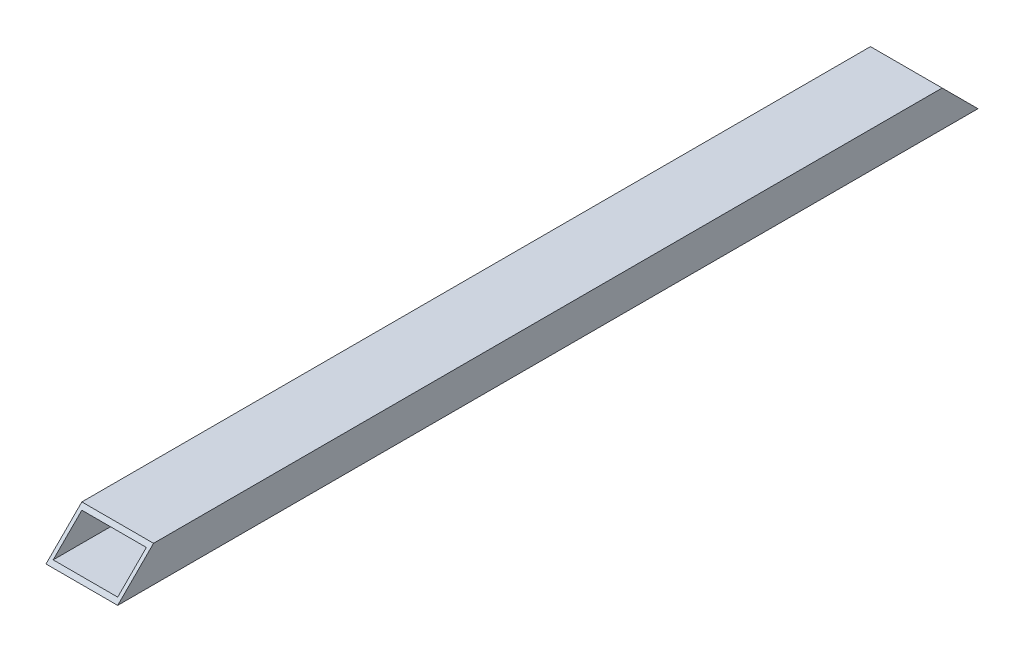
ISO-10303-21;
HEADER;
FILE_DESCRIPTION(('STEP AP214'),'2;1');
FILE_NAME('part.step','',(''),(''),'','','');
FILE_SCHEMA(('AUTOMOTIVE_DESIGN { 1 0 10303 214 1 1 1 1 }'));
ENDSEC;
DATA;
#1=APPLICATION_CONTEXT('core data for automotive mechanical design processes');
#2=APPLICATION_PROTOCOL_DEFINITION('international standard','automotive_design',2000,#1);
#3=PRODUCT_CONTEXT('',#1,'mechanical');
#4=PRODUCT('Part','Part','',(#3));
#5=PRODUCT_RELATED_PRODUCT_CATEGORY('part','',(#4));
#6=PRODUCT_DEFINITION_FORMATION('','',#4);
#7=PRODUCT_DEFINITION_CONTEXT('part definition',#1,'design');
#8=PRODUCT_DEFINITION('design','',#6,#7);
#9=PRODUCT_DEFINITION_SHAPE('','',#8);
#10=(LENGTH_UNIT() NAMED_UNIT(*) SI_UNIT(.MILLI.,.METRE.));
#11=(NAMED_UNIT(*) PLANE_ANGLE_UNIT() SI_UNIT($,.RADIAN.));
#12=(NAMED_UNIT(*) SI_UNIT($,.STERADIAN.) SOLID_ANGLE_UNIT());
#13=UNCERTAINTY_MEASURE_WITH_UNIT(LENGTH_MEASURE(1.E-05),#10,'distance_accuracy_value','');
#14=(GEOMETRIC_REPRESENTATION_CONTEXT(3) GLOBAL_UNCERTAINTY_ASSIGNED_CONTEXT((#13)) GLOBAL_UNIT_ASSIGNED_CONTEXT((#10,
#11,#12)) REPRESENTATION_CONTEXT('',''));
#15=CARTESIAN_POINT('',(0.,0.,0.));
#16=DIRECTION('',(0.,0.,1.));
#17=DIRECTION('',(1.,0.,0.));
#18=AXIS2_PLACEMENT_3D('',#15,#16,#17);
#19=CARTESIAN_POINT('',(2.,-2.,480.));
#20=DIRECTION('',(0.,-1.,0.));
#21=DIRECTION('',(0.,0.,-1.));
#22=AXIS2_PLACEMENT_3D('',#19,#20,#21);
#23=PLANE('',#22);
#24=DIRECTION('',(1.,0.,0.));
#25=VECTOR('',#24,1.);
#26=CARTESIAN_POINT('',(2.,-2.,462.));
#27=LINE('',#26,#25);
#28=CARTESIAN_POINT('',(2.,-2.,462.));
#29=VERTEX_POINT('',#28);
#30=CARTESIAN_POINT('',(38.,-2.,462.));
#31=VERTEX_POINT('',#30);
#32=EDGE_CURVE('E11',#29,#31,#27,.T.);
#33=ORIENTED_EDGE('',*,*,#32,.F.);
#34=DIRECTION('',(0.,0.,-1.));
#35=VECTOR('',#34,1.);
#36=CARTESIAN_POINT('',(2.,-2.,480.));
#37=LINE('',#36,#35);
#38=CARTESIAN_POINT('',(2.,-2.,17.9999999999999));
#39=VERTEX_POINT('',#38);
#40=EDGE_CURVE('E141',#29,#39,#37,.T.);
#41=ORIENTED_EDGE('',*,*,#40,.T.);
#42=DIRECTION('',(-1.,0.,0.));
#43=VECTOR('',#42,1.);
#44=CARTESIAN_POINT('',(1.99999999999989,-2.,17.9999999999999));
#45=LINE('',#44,#43);
#46=CARTESIAN_POINT('',(38.,-2.,17.9999999999999));
#47=VERTEX_POINT('',#46);
#48=EDGE_CURVE('E49',#47,#39,#45,.T.);
#49=ORIENTED_EDGE('',*,*,#48,.F.);
#50=DIRECTION('',(0.,0.,-1.));
#51=VECTOR('',#50,1.);
#52=CARTESIAN_POINT('',(38.,-2.,480.));
#53=LINE('',#52,#51);
#54=EDGE_CURVE('E138',#31,#47,#53,.T.);
#55=ORIENTED_EDGE('',*,*,#54,.F.);
#56=EDGE_LOOP('',(#33,#41,#49,#55));
#57=FACE_BOUND('',#56,.T.);
#58=ADVANCED_FACE('F41',(#57),#23,.T.);
#59=CARTESIAN_POINT('',(38.,-2.,480.));
#60=DIRECTION('',(-1.,0.,0.));
#61=DIRECTION('',(0.,0.,1.));
#62=AXIS2_PLACEMENT_3D('',#59,#60,#61);
#63=PLANE('',#62);
#64=DIRECTION('',(0.,-0.707106781186549,0.707106781186546));
#65=VECTOR('',#64,1.);
#66=CARTESIAN_POINT('',(38.,-11.,471.));
#67=LINE('',#66,#65);
#68=CARTESIAN_POINT('',(38.,-18.,478.));
#69=VERTEX_POINT('',#68);
#70=EDGE_CURVE('E148',#31,#69,#67,.T.);
#71=ORIENTED_EDGE('',*,*,#70,.F.);
#72=ORIENTED_EDGE('',*,*,#54,.T.);
#73=DIRECTION('',(0.,0.70710678118655,0.707106781186545));
#74=VECTOR('',#73,1.);
#75=CARTESIAN_POINT('',(38.,229.,248.999999999998));
#76=LINE('',#75,#74);
#77=CARTESIAN_POINT('',(38.,-18.,1.99999999999995));
#78=VERTEX_POINT('',#77);
#79=EDGE_CURVE('E154',#78,#47,#76,.T.);
#80=ORIENTED_EDGE('',*,*,#79,.F.);
#81=DIRECTION('',(0.,0.,-1.));
#82=VECTOR('',#81,1.);
#83=CARTESIAN_POINT('',(38.,-18.,480.));
#84=LINE('',#83,#82);
#85=EDGE_CURVE('E135',#69,#78,#84,.T.);
#86=ORIENTED_EDGE('',*,*,#85,.F.);
#87=EDGE_LOOP('',(#71,#72,#80,#86));
#88=FACE_BOUND('',#87,.T.);
#89=ADVANCED_FACE('F184',(#88),#63,.T.);
#90=CARTESIAN_POINT('',(2.,-18.,480.));
#91=DIRECTION('',(0.,1.,0.));
#92=DIRECTION('',(0.,0.,1.));
#93=AXIS2_PLACEMENT_3D('',#90,#91,#92);
#94=PLANE('',#93);
#95=DIRECTION('',(-1.,0.,0.));
#96=VECTOR('',#95,1.);
#97=CARTESIAN_POINT('',(2.,-18.,478.));
#98=LINE('',#97,#96);
#99=CARTESIAN_POINT('',(2.,-18.,478.));
#100=VERTEX_POINT('',#99);
#101=EDGE_CURVE('E146',#69,#100,#98,.T.);
#102=ORIENTED_EDGE('',*,*,#101,.F.);
#103=ORIENTED_EDGE('',*,*,#85,.T.);
#104=DIRECTION('',(1.,0.,0.));
#105=VECTOR('',#104,1.);
#106=CARTESIAN_POINT('',(1.99999999999989,-18.,2.));
#107=LINE('',#106,#105);
#108=CARTESIAN_POINT('',(2.,-18.,2.));
#109=VERTEX_POINT('',#108);
#110=EDGE_CURVE('E152',#109,#78,#107,.T.);
#111=ORIENTED_EDGE('',*,*,#110,.F.);
#112=DIRECTION('',(0.,0.,-1.));
#113=VECTOR('',#112,1.);
#114=CARTESIAN_POINT('',(2.,-18.,480.));
#115=LINE('',#114,#113);
#116=EDGE_CURVE('E131',#100,#109,#115,.T.);
#117=ORIENTED_EDGE('',*,*,#116,.F.);
#118=EDGE_LOOP('',(#102,#103,#111,#117));
#119=FACE_BOUND('',#118,.T.);
#120=ADVANCED_FACE('F179',(#119),#94,.T.);
#121=CARTESIAN_POINT('',(2.,-2.,480.));
#122=DIRECTION('',(1.,0.,0.));
#123=DIRECTION('',(0.,1.,0.));
#124=AXIS2_PLACEMENT_3D('',#121,#122,#123);
#125=PLANE('',#124);
#126=DIRECTION('',(0.,0.707106781186549,-0.707106781186546));
#127=VECTOR('',#126,1.);
#128=CARTESIAN_POINT('',(2.,-11.,471.));
#129=LINE('',#128,#127);
#130=EDGE_CURVE('E144',#100,#29,#129,.T.);
#131=ORIENTED_EDGE('',*,*,#130,.F.);
#132=ORIENTED_EDGE('',*,*,#116,.T.);
#133=DIRECTION('',(0.,-0.70710678118655,-0.707106781186545));
#134=VECTOR('',#133,1.);
#135=CARTESIAN_POINT('',(1.99999999999996,229.,248.999999999998));
#136=LINE('',#135,#134);
#137=EDGE_CURVE('E150',#39,#109,#136,.T.);
#138=ORIENTED_EDGE('',*,*,#137,.F.);
#139=ORIENTED_EDGE('',*,*,#40,.F.);
#140=EDGE_LOOP('',(#131,#132,#138,#139));
#141=FACE_BOUND('',#140,.T.);
#142=ADVANCED_FACE('F170',(#141),#125,.T.);
#143=CARTESIAN_POINT('',(0.,-20.,0.));
#144=DIRECTION('',(0.,-0.707106781186545,0.70710678118655));
#145=DIRECTION('',(0.,-0.70710678118655,-0.707106781186545));
#146=AXIS2_PLACEMENT_3D('',#143,#144,#145);
#147=PLANE('',#146);
#148=ORIENTED_EDGE('',*,*,#137,.T.);
#149=ORIENTED_EDGE('',*,*,#110,.T.);
#150=ORIENTED_EDGE('',*,*,#79,.T.);
#151=ORIENTED_EDGE('',*,*,#48,.T.);
#152=EDGE_LOOP('',(#148,#149,#150,#151));
#153=FACE_BOUND('',#152,.T.);
#154=DIRECTION('',(0.,-0.70710678118655,-0.707106781186545));
#155=VECTOR('',#154,1.);
#156=CARTESIAN_POINT('',(40.,-20.,0.));
#157=LINE('',#156,#155);
#158=CARTESIAN_POINT('',(40.,0.,19.9999999999999));
#159=VERTEX_POINT('',#158);
#160=CARTESIAN_POINT('',(40.,-20.,0.));
#161=VERTEX_POINT('',#160);
#162=EDGE_CURVE('E158',#159,#161,#157,.T.);
#163=ORIENTED_EDGE('',*,*,#162,.T.);
#164=DIRECTION('',(1.,0.,0.));
#165=VECTOR('',#164,1.);
#166=CARTESIAN_POINT('',(0.,-20.,0.));
#167=LINE('',#166,#165);
#168=CARTESIAN_POINT('',(0.,-20.,0.));
#169=VERTEX_POINT('',#168);
#170=EDGE_CURVE('E122',#169,#161,#167,.T.);
#171=ORIENTED_EDGE('',*,*,#170,.F.);
#172=DIRECTION('',(0.,-0.70710678118655,-0.707106781186545));
#173=VECTOR('',#172,1.);
#174=CARTESIAN_POINT('',(0.,-20.,0.));
#175=LINE('',#174,#173);
#176=CARTESIAN_POINT('',(0.,0.,20.));
#177=VERTEX_POINT('',#176);
#178=EDGE_CURVE('E64',#177,#169,#175,.T.);
#179=ORIENTED_EDGE('',*,*,#178,.F.);
#180=DIRECTION('',(1.,0.,0.));
#181=VECTOR('',#180,1.);
#182=CARTESIAN_POINT('',(0.,0.,19.9999999999999));
#183=LINE('',#182,#181);
#184=EDGE_CURVE('E156',#177,#159,#183,.T.);
#185=ORIENTED_EDGE('',*,*,#184,.T.);
#186=EDGE_LOOP('',(#163,#171,#179,#185));
#187=FACE_BOUND('',#186,.T.);
#188=ADVANCED_FACE('F168',(#153,#187),#147,.F.);
#189=CARTESIAN_POINT('',(0.,-20.,480.));
#190=DIRECTION('',(0.,-0.707106781186546,-0.707106781186549));
#191=DIRECTION('',(0.,0.707106781186549,-0.707106781186546));
#192=AXIS2_PLACEMENT_3D('',#189,#190,#191);
#193=PLANE('',#192);
#194=ORIENTED_EDGE('',*,*,#130,.T.);
#195=ORIENTED_EDGE('',*,*,#32,.T.);
#196=ORIENTED_EDGE('',*,*,#70,.T.);
#197=ORIENTED_EDGE('',*,*,#101,.T.);
#198=EDGE_LOOP('',(#194,#195,#196,#197));
#199=FACE_BOUND('',#198,.T.);
#200=DIRECTION('',(0.,0.707106781186549,-0.707106781186546));
#201=VECTOR('',#200,1.);
#202=CARTESIAN_POINT('',(40.,-20.,480.));
#203=LINE('',#202,#201);
#204=CARTESIAN_POINT('',(40.,-20.,480.));
#205=VERTEX_POINT('',#204);
#206=CARTESIAN_POINT('',(40.,0.,460.));
#207=VERTEX_POINT('',#206);
#208=EDGE_CURVE('E56',#205,#207,#203,.T.);
#209=ORIENTED_EDGE('',*,*,#208,.T.);
#210=DIRECTION('',(1.,0.,0.));
#211=VECTOR('',#210,1.);
#212=CARTESIAN_POINT('',(0.,0.,460.));
#213=LINE('',#212,#211);
#214=CARTESIAN_POINT('',(0.,0.,460.));
#215=VERTEX_POINT('',#214);
#216=EDGE_CURVE('E107',#215,#207,#213,.T.);
#217=ORIENTED_EDGE('',*,*,#216,.F.);
#218=DIRECTION('',(0.,0.707106781186549,-0.707106781186546));
#219=VECTOR('',#218,1.);
#220=CARTESIAN_POINT('',(0.,-20.,480.));
#221=LINE('',#220,#219);
#222=CARTESIAN_POINT('',(0.,-20.,480.));
#223=VERTEX_POINT('',#222);
#224=EDGE_CURVE('E103',#223,#215,#221,.T.);
#225=ORIENTED_EDGE('',*,*,#224,.F.);
#226=DIRECTION('',(1.,0.,0.));
#227=VECTOR('',#226,1.);
#228=CARTESIAN_POINT('',(0.,-20.,480.));
#229=LINE('',#228,#227);
#230=EDGE_CURVE('E106',#223,#205,#229,.T.);
#231=ORIENTED_EDGE('',*,*,#230,.T.);
#232=EDGE_LOOP('',(#209,#217,#225,#231));
#233=FACE_BOUND('',#232,.T.);
#234=ADVANCED_FACE('F105',(#199,#233),#193,.F.);
#235=CARTESIAN_POINT('',(0.,0.,480.));
#236=DIRECTION('',(1.,0.,0.));
#237=DIRECTION('',(0.,1.,0.));
#238=AXIS2_PLACEMENT_3D('',#235,#236,#237);
#239=PLANE('',#238);
#240=DIRECTION('',(0.,0.,-1.));
#241=VECTOR('',#240,1.);
#242=CARTESIAN_POINT('',(0.,-20.,480.));
#243=LINE('',#242,#241);
#244=EDGE_CURVE('E118',#223,#169,#243,.T.);
#245=ORIENTED_EDGE('',*,*,#244,.F.);
#246=ORIENTED_EDGE('',*,*,#224,.T.);
#247=DIRECTION('',(0.,0.,-1.));
#248=VECTOR('',#247,1.);
#249=CARTESIAN_POINT('',(0.,0.,480.));
#250=LINE('',#249,#248);
#251=EDGE_CURVE('E121',#215,#177,#250,.T.);
#252=ORIENTED_EDGE('',*,*,#251,.T.);
#253=ORIENTED_EDGE('',*,*,#178,.T.);
#254=EDGE_LOOP('',(#245,#246,#252,#253));
#255=FACE_BOUND('',#254,.T.);
#256=ADVANCED_FACE('F43',(#255),#239,.F.);
#257=CARTESIAN_POINT('',(0.,-20.,480.));
#258=DIRECTION('',(0.,1.,0.));
#259=DIRECTION('',(0.,0.,1.));
#260=AXIS2_PLACEMENT_3D('',#257,#258,#259);
#261=PLANE('',#260);
#262=ORIENTED_EDGE('',*,*,#170,.T.);
#263=DIRECTION('',(0.,0.,-1.));
#264=VECTOR('',#263,1.);
#265=CARTESIAN_POINT('',(40.,-20.,480.));
#266=LINE('',#265,#264);
#267=EDGE_CURVE('E120',#205,#161,#266,.T.);
#268=ORIENTED_EDGE('',*,*,#267,.F.);
#269=ORIENTED_EDGE('',*,*,#230,.F.);
#270=ORIENTED_EDGE('',*,*,#244,.T.);
#271=EDGE_LOOP('',(#262,#268,#269,#270));
#272=FACE_BOUND('',#271,.T.);
#273=ADVANCED_FACE('F117',(#272),#261,.F.);
#274=CARTESIAN_POINT('',(40.,0.,480.));
#275=DIRECTION('',(-1.,0.,0.));
#276=DIRECTION('',(0.,-1.,0.));
#277=AXIS2_PLACEMENT_3D('',#274,#275,#276);
#278=PLANE('',#277);
#279=DIRECTION('',(0.,0.,-1.));
#280=VECTOR('',#279,1.);
#281=CARTESIAN_POINT('',(40.,0.,480.));
#282=LINE('',#281,#280);
#283=EDGE_CURVE('E125',#207,#159,#282,.T.);
#284=ORIENTED_EDGE('',*,*,#283,.F.);
#285=ORIENTED_EDGE('',*,*,#208,.F.);
#286=ORIENTED_EDGE('',*,*,#267,.T.);
#287=ORIENTED_EDGE('',*,*,#162,.F.);
#288=EDGE_LOOP('',(#284,#285,#286,#287));
#289=FACE_BOUND('',#288,.T.);
#290=ADVANCED_FACE('F167',(#289),#278,.F.);
#291=CARTESIAN_POINT('',(0.,0.,480.));
#292=DIRECTION('',(0.,-1.,0.));
#293=DIRECTION('',(0.,0.,-1.));
#294=AXIS2_PLACEMENT_3D('',#291,#292,#293);
#295=PLANE('',#294);
#296=ORIENTED_EDGE('',*,*,#251,.F.);
#297=ORIENTED_EDGE('',*,*,#216,.T.);
#298=ORIENTED_EDGE('',*,*,#283,.T.);
#299=ORIENTED_EDGE('',*,*,#184,.F.);
#300=EDGE_LOOP('',(#296,#297,#298,#299));
#301=FACE_BOUND('',#300,.T.);
#302=ADVANCED_FACE('F164',(#301),#295,.F.);
#303=CLOSED_SHELL('',(#58,#89,#120,#142,#188,#234,#256,#273,#290,#302));
#304=MANIFOLD_SOLID_BREP('B2',#303);
#305=ADVANCED_BREP_SHAPE_REPRESENTATION('',(#18,#304),#14);
#306=SHAPE_DEFINITION_REPRESENTATION(#9,#305);
ENDSEC;
END-ISO-10303-21;
